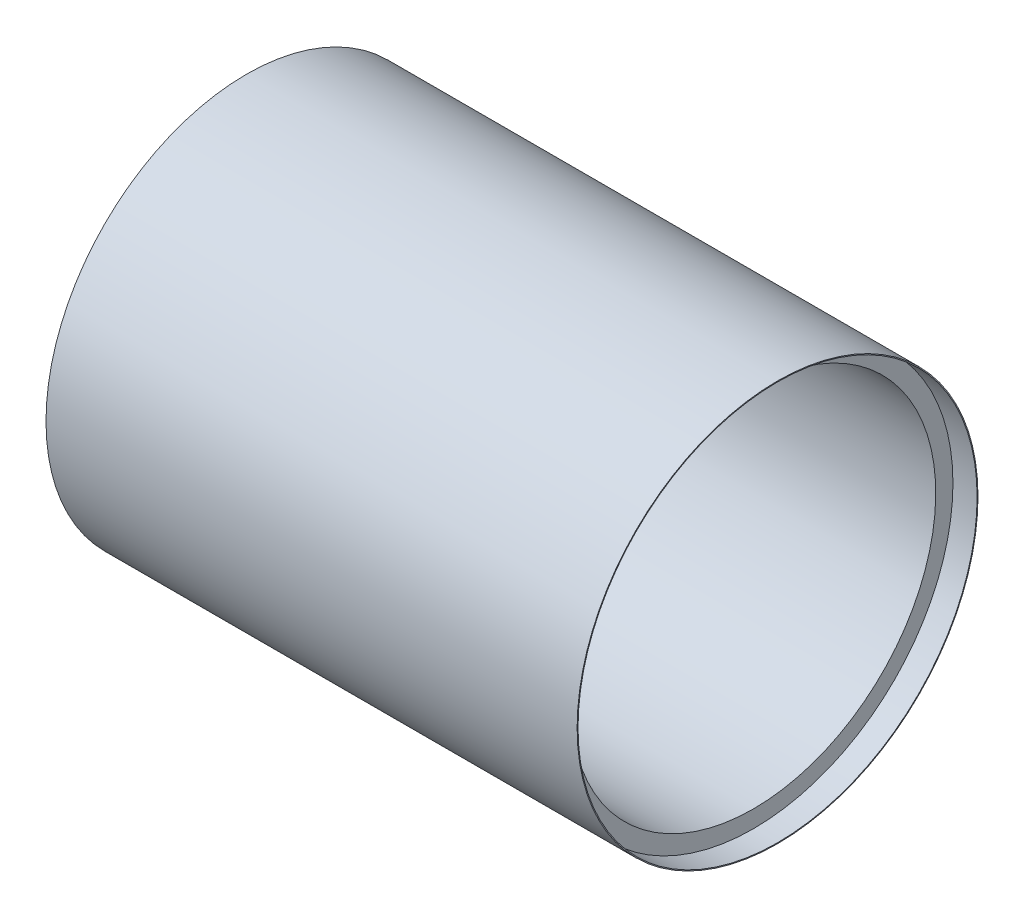
ISO-10303-21;
HEADER;
FILE_DESCRIPTION(('STEP AP214'),'2;1');
FILE_NAME('part.step','',(''),(''),'','','');
FILE_SCHEMA(('AUTOMOTIVE_DESIGN { 1 0 10303 214 1 1 1 1 }'));
ENDSEC;
DATA;
#1=APPLICATION_CONTEXT('core data for automotive mechanical design processes');
#2=APPLICATION_PROTOCOL_DEFINITION('international standard','automotive_design',2000,#1);
#3=PRODUCT_CONTEXT('',#1,'mechanical');
#4=PRODUCT('Part','Part','',(#3));
#5=PRODUCT_RELATED_PRODUCT_CATEGORY('part','',(#4));
#6=PRODUCT_DEFINITION_FORMATION('','',#4);
#7=PRODUCT_DEFINITION_CONTEXT('part definition',#1,'design');
#8=PRODUCT_DEFINITION('design','',#6,#7);
#9=PRODUCT_DEFINITION_SHAPE('','',#8);
#10=(LENGTH_UNIT() NAMED_UNIT(*) SI_UNIT(.MILLI.,.METRE.));
#11=(NAMED_UNIT(*) PLANE_ANGLE_UNIT() SI_UNIT($,.RADIAN.));
#12=(NAMED_UNIT(*) SI_UNIT($,.STERADIAN.) SOLID_ANGLE_UNIT());
#13=UNCERTAINTY_MEASURE_WITH_UNIT(LENGTH_MEASURE(1.E-05),#10,'distance_accuracy_value','');
#14=(GEOMETRIC_REPRESENTATION_CONTEXT(3) GLOBAL_UNCERTAINTY_ASSIGNED_CONTEXT((#13)) GLOBAL_UNIT_ASSIGNED_CONTEXT((#10,
#11,#12)) REPRESENTATION_CONTEXT('',''));
#15=CARTESIAN_POINT('',(0.,0.,0.));
#16=DIRECTION('',(0.,0.,1.));
#17=DIRECTION('',(1.,0.,0.));
#18=AXIS2_PLACEMENT_3D('',#15,#16,#17);
#19=CARTESIAN_POINT('',(0.,0.,0.));
#20=DIRECTION('',(-1.,0.,0.));
#21=DIRECTION('',(0.,-1.,0.));
#22=AXIS2_PLACEMENT_3D('',#19,#20,#21);
#23=CYLINDRICAL_SURFACE('',#22,84.3534);
#24=CARTESIAN_POINT('',(39.146309032124,0.,0.));
#25=DIRECTION('',(-1.,0.,0.));
#26=DIRECTION('',(0.,-1.,0.));
#27=AXIS2_PLACEMENT_3D('',#24,#25,#26);
#28=CIRCLE('',#27,84.3534);
#29=CARTESIAN_POINT('',(39.146309032124,-84.3534,0.));
#30=VERTEX_POINT('',#29);
#31=EDGE_CURVE('E10',#30,#30,#28,.T.);
#32=ORIENTED_EDGE('',*,*,#31,.F.);
#33=EDGE_LOOP('',(#32));
#34=FACE_BOUND('',#33,.T.);
#35=CARTESIAN_POINT('',(262.666309032124,0.,0.));
#36=DIRECTION('',(-1.,0.,0.));
#37=DIRECTION('',(0.,-1.,0.));
#38=AXIS2_PLACEMENT_3D('',#35,#36,#37);
#39=CIRCLE('',#38,84.3534);
#40=CARTESIAN_POINT('',(262.666309032124,-84.3534,0.));
#41=VERTEX_POINT('',#40);
#42=EDGE_CURVE('E60',#41,#41,#39,.T.);
#43=ORIENTED_EDGE('',*,*,#42,.T.);
#44=EDGE_LOOP('',(#43));
#45=FACE_BOUND('',#44,.T.);
#46=ADVANCED_FACE('F32',(#34,#45),#23,.T.);
#47=CARTESIAN_POINT('',(39.146309032124,0.,0.));
#48=DIRECTION('',(1.,0.,0.));
#49=DIRECTION('',(0.,1.,0.));
#50=AXIS2_PLACEMENT_3D('',#47,#48,#49);
#51=PLANE('',#50);
#52=CARTESIAN_POINT('',(39.146309032124,0.,0.));
#53=DIRECTION('',(-1.,0.,0.));
#54=DIRECTION('',(0.,-1.,0.));
#55=AXIS2_PLACEMENT_3D('',#52,#53,#54);
#56=CIRCLE('',#55,83.9724);
#57=CARTESIAN_POINT('',(39.146309032124,-83.9724,0.));
#58=VERTEX_POINT('',#57);
#59=EDGE_CURVE('E38',#58,#58,#56,.T.);
#60=ORIENTED_EDGE('',*,*,#59,.F.);
#61=EDGE_LOOP('',(#60));
#62=FACE_BOUND('',#61,.T.);
#63=ORIENTED_EDGE('',*,*,#31,.T.);
#64=EDGE_LOOP('',(#63));
#65=FACE_BOUND('',#64,.T.);
#66=ADVANCED_FACE('F97',(#62,#65),#51,.F.);
#67=CARTESIAN_POINT('',(0.,0.,0.));
#68=DIRECTION('',(-1.,0.,0.));
#69=DIRECTION('',(0.,-1.,0.));
#70=AXIS2_PLACEMENT_3D('',#67,#68,#69);
#71=CYLINDRICAL_SURFACE('',#70,83.9724);
#72=CARTESIAN_POINT('',(49.306309032124,0.,0.));
#73=DIRECTION('',(-1.,0.,0.));
#74=DIRECTION('',(0.,-1.,0.));
#75=AXIS2_PLACEMENT_3D('',#72,#73,#74);
#76=CIRCLE('',#75,83.9724);
#77=CARTESIAN_POINT('',(49.306309032124,-83.9724,0.));
#78=VERTEX_POINT('',#77);
#79=EDGE_CURVE('E42',#78,#78,#76,.T.);
#80=ORIENTED_EDGE('',*,*,#79,.F.);
#81=EDGE_LOOP('',(#80));
#82=FACE_BOUND('',#81,.T.);
#83=ORIENTED_EDGE('',*,*,#59,.T.);
#84=EDGE_LOOP('',(#83));
#85=FACE_BOUND('',#84,.T.);
#86=ADVANCED_FACE('F92',(#82,#85),#71,.F.);
#87=CARTESIAN_POINT('',(49.306309032124,0.,0.));
#88=DIRECTION('',(1.,0.,0.));
#89=DIRECTION('',(0.,1.,0.));
#90=AXIS2_PLACEMENT_3D('',#87,#88,#89);
#91=PLANE('',#90);
#92=CARTESIAN_POINT('',(49.306309032124,0.,0.));
#93=DIRECTION('',(-1.,0.,0.));
#94=DIRECTION('',(0.,-1.,0.));
#95=AXIS2_PLACEMENT_3D('',#92,#93,#94);
#96=CIRCLE('',#95,76.7334);
#97=CARTESIAN_POINT('',(49.306309032124,-76.7334,0.));
#98=VERTEX_POINT('',#97);
#99=EDGE_CURVE('E46',#98,#98,#96,.T.);
#100=ORIENTED_EDGE('',*,*,#99,.F.);
#101=EDGE_LOOP('',(#100));
#102=FACE_BOUND('',#101,.T.);
#103=ORIENTED_EDGE('',*,*,#79,.T.);
#104=EDGE_LOOP('',(#103));
#105=FACE_BOUND('',#104,.T.);
#106=ADVANCED_FACE('F86',(#102,#105),#91,.F.);
#107=CARTESIAN_POINT('',(0.,0.,0.));
#108=DIRECTION('',(-1.,0.,0.));
#109=DIRECTION('',(0.,-1.,0.));
#110=AXIS2_PLACEMENT_3D('',#107,#108,#109);
#111=CYLINDRICAL_SURFACE('',#110,76.7334);
#112=CARTESIAN_POINT('',(252.506309032124,0.,0.));
#113=DIRECTION('',(-1.,0.,0.));
#114=DIRECTION('',(0.,-1.,0.));
#115=AXIS2_PLACEMENT_3D('',#112,#113,#114);
#116=CIRCLE('',#115,76.7334);
#117=CARTESIAN_POINT('',(252.506309032124,-76.7334,0.));
#118=VERTEX_POINT('',#117);
#119=EDGE_CURVE('E51',#118,#118,#116,.T.);
#120=ORIENTED_EDGE('',*,*,#119,.F.);
#121=EDGE_LOOP('',(#120));
#122=FACE_BOUND('',#121,.T.);
#123=ORIENTED_EDGE('',*,*,#99,.T.);
#124=EDGE_LOOP('',(#123));
#125=FACE_BOUND('',#124,.T.);
#126=ADVANCED_FACE('F80',(#122,#125),#111,.F.);
#127=CARTESIAN_POINT('',(252.506309032124,0.,0.));
#128=DIRECTION('',(-1.,0.,0.));
#129=DIRECTION('',(0.,-1.,0.));
#130=AXIS2_PLACEMENT_3D('',#127,#128,#129);
#131=PLANE('',#130);
#132=CARTESIAN_POINT('',(252.506309032124,0.,0.));
#133=DIRECTION('',(-1.,0.,0.));
#134=DIRECTION('',(0.,-1.,0.));
#135=AXIS2_PLACEMENT_3D('',#132,#133,#134);
#136=CIRCLE('',#135,83.9724);
#137=CARTESIAN_POINT('',(252.506309032124,-83.9724,0.));
#138=VERTEX_POINT('',#137);
#139=EDGE_CURVE('E54',#138,#138,#136,.T.);
#140=ORIENTED_EDGE('',*,*,#139,.F.);
#141=EDGE_LOOP('',(#140));
#142=FACE_BOUND('',#141,.T.);
#143=ORIENTED_EDGE('',*,*,#119,.T.);
#144=EDGE_LOOP('',(#143));
#145=FACE_BOUND('',#144,.T.);
#146=ADVANCED_FACE('F74',(#142,#145),#131,.F.);
#147=CARTESIAN_POINT('',(0.,0.,0.));
#148=DIRECTION('',(-1.,0.,0.));
#149=DIRECTION('',(0.,-1.,0.));
#150=AXIS2_PLACEMENT_3D('',#147,#148,#149);
#151=CYLINDRICAL_SURFACE('',#150,83.9724);
#152=CARTESIAN_POINT('',(262.666309032124,0.,0.));
#153=DIRECTION('',(-1.,0.,0.));
#154=DIRECTION('',(0.,-1.,0.));
#155=AXIS2_PLACEMENT_3D('',#152,#153,#154);
#156=CIRCLE('',#155,83.9724);
#157=CARTESIAN_POINT('',(262.666309032124,-83.9724,0.));
#158=VERTEX_POINT('',#157);
#159=EDGE_CURVE('E57',#158,#158,#156,.T.);
#160=ORIENTED_EDGE('',*,*,#159,.F.);
#161=EDGE_LOOP('',(#160));
#162=FACE_BOUND('',#161,.T.);
#163=ORIENTED_EDGE('',*,*,#139,.T.);
#164=EDGE_LOOP('',(#163));
#165=FACE_BOUND('',#164,.T.);
#166=ADVANCED_FACE('F68',(#162,#165),#151,.F.);
#167=CARTESIAN_POINT('',(262.666309032124,0.,0.));
#168=DIRECTION('',(-1.,0.,0.));
#169=DIRECTION('',(0.,-1.,0.));
#170=AXIS2_PLACEMENT_3D('',#167,#168,#169);
#171=PLANE('',#170);
#172=ORIENTED_EDGE('',*,*,#42,.F.);
#173=EDGE_LOOP('',(#172));
#174=FACE_BOUND('',#173,.T.);
#175=ORIENTED_EDGE('',*,*,#159,.T.);
#176=EDGE_LOOP('',(#175));
#177=FACE_BOUND('',#176,.T.);
#178=ADVANCED_FACE('F65',(#174,#177),#171,.F.);
#179=CLOSED_SHELL('',(#46,#66,#86,#106,#126,#146,#166,#178));
#180=MANIFOLD_SOLID_BREP('B2',#179);
#181=ADVANCED_BREP_SHAPE_REPRESENTATION('',(#18,#180),#14);
#182=SHAPE_DEFINITION_REPRESENTATION(#9,#181);
ENDSEC;
END-ISO-10303-21;
